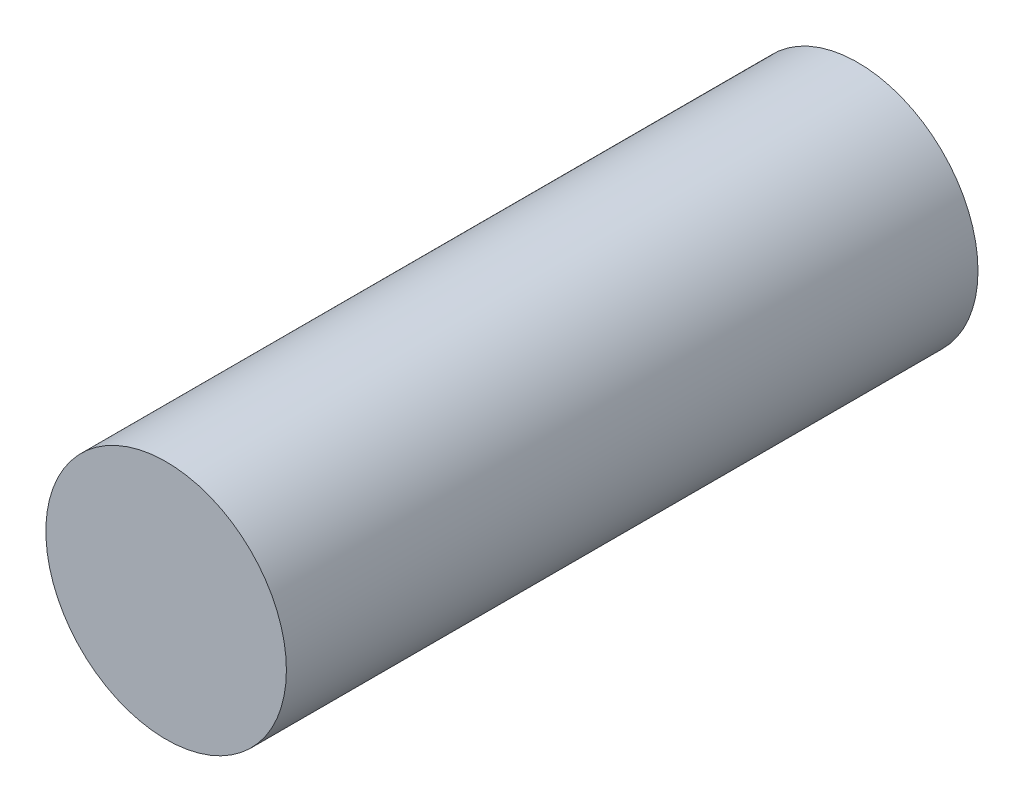
ISO-10303-21;
HEADER;
FILE_DESCRIPTION(('STEP AP214'),'2;1');
FILE_NAME('part.step','',(''),(''),'','','');
FILE_SCHEMA(('AUTOMOTIVE_DESIGN { 1 0 10303 214 1 1 1 1 }'));
ENDSEC;
DATA;
#1=APPLICATION_CONTEXT('core data for automotive mechanical design processes');
#2=APPLICATION_PROTOCOL_DEFINITION('international standard','automotive_design',2000,#1);
#3=PRODUCT_CONTEXT('',#1,'mechanical');
#4=PRODUCT('Part','Part','',(#3));
#5=PRODUCT_RELATED_PRODUCT_CATEGORY('part','',(#4));
#6=PRODUCT_DEFINITION_FORMATION('','',#4);
#7=PRODUCT_DEFINITION_CONTEXT('part definition',#1,'design');
#8=PRODUCT_DEFINITION('design','',#6,#7);
#9=PRODUCT_DEFINITION_SHAPE('','',#8);
#10=(LENGTH_UNIT() NAMED_UNIT(*) SI_UNIT(.MILLI.,.METRE.));
#11=(NAMED_UNIT(*) PLANE_ANGLE_UNIT() SI_UNIT($,.RADIAN.));
#12=(NAMED_UNIT(*) SI_UNIT($,.STERADIAN.) SOLID_ANGLE_UNIT());
#13=UNCERTAINTY_MEASURE_WITH_UNIT(LENGTH_MEASURE(1.E-05),#10,'distance_accuracy_value','');
#14=(GEOMETRIC_REPRESENTATION_CONTEXT(3) GLOBAL_UNCERTAINTY_ASSIGNED_CONTEXT((#13)) GLOBAL_UNIT_ASSIGNED_CONTEXT((#10,
#11,#12)) REPRESENTATION_CONTEXT('',''));
#15=CARTESIAN_POINT('',(0.,0.,0.));
#16=DIRECTION('',(0.,0.,1.));
#17=DIRECTION('',(1.,0.,0.));
#18=AXIS2_PLACEMENT_3D('',#15,#16,#17);
#19=CARTESIAN_POINT('',(0.,0.,36.5125));
#20=DIRECTION('',(0.,0.,-1.));
#21=DIRECTION('',(-1.,0.,0.));
#22=AXIS2_PLACEMENT_3D('',#19,#20,#21);
#23=CYLINDRICAL_SURFACE('',#22,6.35);
#24=CARTESIAN_POINT('',(0.,0.,36.5125));
#25=DIRECTION('',(0.,0.,1.));
#26=DIRECTION('',(1.,0.,0.));
#27=AXIS2_PLACEMENT_3D('',#24,#25,#26);
#28=CIRCLE('',#27,6.35);
#29=CARTESIAN_POINT('',(6.35,0.,36.5125));
#30=VERTEX_POINT('',#29);
#31=EDGE_CURVE('E10',#30,#30,#28,.T.);
#32=ORIENTED_EDGE('',*,*,#31,.F.);
#33=EDGE_LOOP('',(#32));
#34=FACE_BOUND('',#33,.T.);
#35=CARTESIAN_POINT('',(0.,0.,0.));
#36=DIRECTION('',(0.,0.,1.));
#37=DIRECTION('',(1.,0.,0.));
#38=AXIS2_PLACEMENT_3D('',#35,#36,#37);
#39=CIRCLE('',#38,6.35);
#40=CARTESIAN_POINT('',(6.35,0.,0.));
#41=VERTEX_POINT('',#40);
#42=EDGE_CURVE('E34',#41,#41,#39,.T.);
#43=ORIENTED_EDGE('',*,*,#42,.T.);
#44=EDGE_LOOP('',(#43));
#45=FACE_BOUND('',#44,.T.);
#46=ADVANCED_FACE('F31',(#34,#45),#23,.T.);
#47=CARTESIAN_POINT('',(0.,0.,36.5125));
#48=DIRECTION('',(0.,0.,1.));
#49=DIRECTION('',(1.,0.,0.));
#50=AXIS2_PLACEMENT_3D('',#47,#48,#49);
#51=PLANE('',#50);
#52=ORIENTED_EDGE('',*,*,#31,.T.);
#53=EDGE_LOOP('',(#52));
#54=FACE_BOUND('',#53,.T.);
#55=ADVANCED_FACE('F46',(#54),#51,.T.);
#56=CARTESIAN_POINT('',(0.,0.,0.));
#57=DIRECTION('',(0.,0.,1.));
#58=DIRECTION('',(1.,0.,0.));
#59=AXIS2_PLACEMENT_3D('',#56,#57,#58);
#60=PLANE('',#59);
#61=ORIENTED_EDGE('',*,*,#42,.F.);
#62=EDGE_LOOP('',(#61));
#63=FACE_BOUND('',#62,.T.);
#64=ADVANCED_FACE('F44',(#63),#60,.F.);
#65=CLOSED_SHELL('',(#46,#55,#64));
#66=MANIFOLD_SOLID_BREP('B2',#65);
#67=ADVANCED_BREP_SHAPE_REPRESENTATION('',(#18,#66),#14);
#68=SHAPE_DEFINITION_REPRESENTATION(#9,#67);
ENDSEC;
END-ISO-10303-21;
